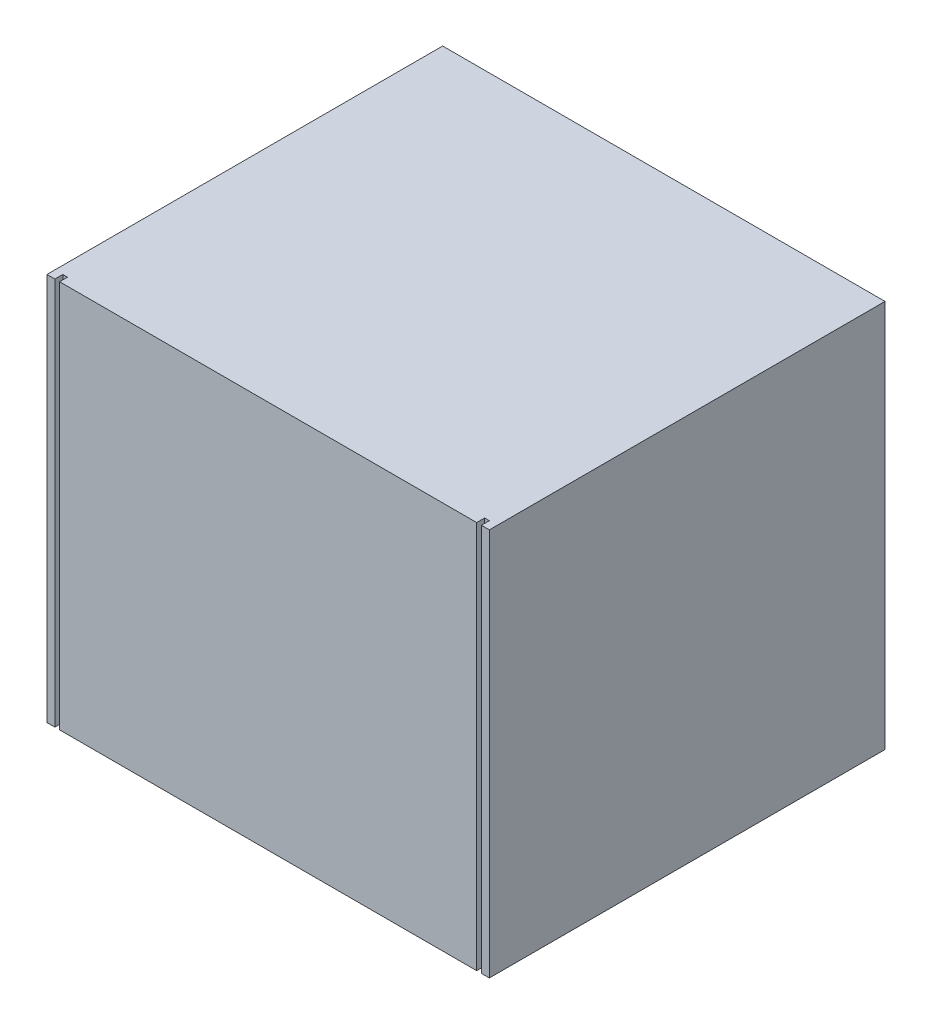
ISO-10303-21;
HEADER;
FILE_DESCRIPTION(('STEP AP214'),'2;1');
FILE_NAME('part.step','',(''),(''),'','','');
FILE_SCHEMA(('AUTOMOTIVE_DESIGN { 1 0 10303 214 1 1 1 1 }'));
ENDSEC;
DATA;
#1=APPLICATION_CONTEXT('core data for automotive mechanical design processes');
#2=APPLICATION_PROTOCOL_DEFINITION('international standard','automotive_design',2000,#1);
#3=PRODUCT_CONTEXT('',#1,'mechanical');
#4=PRODUCT('Part','Part','',(#3));
#5=PRODUCT_RELATED_PRODUCT_CATEGORY('part','',(#4));
#6=PRODUCT_DEFINITION_FORMATION('','',#4);
#7=PRODUCT_DEFINITION_CONTEXT('part definition',#1,'design');
#8=PRODUCT_DEFINITION('design','',#6,#7);
#9=PRODUCT_DEFINITION_SHAPE('','',#8);
#10=(LENGTH_UNIT() NAMED_UNIT(*) SI_UNIT(.MILLI.,.METRE.));
#11=(NAMED_UNIT(*) PLANE_ANGLE_UNIT() SI_UNIT($,.RADIAN.));
#12=(NAMED_UNIT(*) SI_UNIT($,.STERADIAN.) SOLID_ANGLE_UNIT());
#13=UNCERTAINTY_MEASURE_WITH_UNIT(LENGTH_MEASURE(1.E-05),#10,'distance_accuracy_value','');
#14=(GEOMETRIC_REPRESENTATION_CONTEXT(3) GLOBAL_UNCERTAINTY_ASSIGNED_CONTEXT((#13)) GLOBAL_UNIT_ASSIGNED_CONTEXT((#10,
#11,#12)) REPRESENTATION_CONTEXT('',''));
#15=CARTESIAN_POINT('',(0.,0.,0.));
#16=DIRECTION('',(0.,0.,1.));
#17=DIRECTION('',(1.,0.,0.));
#18=AXIS2_PLACEMENT_3D('',#15,#16,#17);
#19=CARTESIAN_POINT('',(0.,0.,400.));
#20=DIRECTION('',(0.,0.,1.));
#21=DIRECTION('',(1.,0.,0.));
#22=AXIS2_PLACEMENT_3D('',#19,#20,#21);
#23=PLANE('',#22);
#24=DIRECTION('',(1.,0.,0.));
#25=VECTOR('',#24,1.);
#26=CARTESIAN_POINT('',(561.74329509592,-634.980484230859,400.));
#27=LINE('',#26,#25);
#28=CARTESIAN_POINT('',(2.72798718913064,-634.980484230859,400.));
#29=VERTEX_POINT('',#28);
#30=CARTESIAN_POINT('',(12.7279871891305,-634.980484230859,400.));
#31=VERTEX_POINT('',#30);
#32=EDGE_CURVE('E461',#29,#31,#27,.T.);
#33=ORIENTED_EDGE('',*,*,#32,.T.);
#34=DIRECTION('',(0.,1.,0.));
#35=VECTOR('',#34,1.);
#36=CARTESIAN_POINT('',(12.7279871891305,-634.980484230859,400.));
#37=LINE('',#36,#35);
#38=CARTESIAN_POINT('',(12.7279871891306,-144.547592356546,400.));
#39=VERTEX_POINT('',#38);
#40=EDGE_CURVE('E254',#31,#39,#37,.T.);
#41=ORIENTED_EDGE('',*,*,#40,.T.);
#42=DIRECTION('',(-1.,0.,0.));
#43=VECTOR('',#42,1.);
#44=CARTESIAN_POINT('',(2.72798718913064,-144.547592356546,400.));
#45=LINE('',#44,#43);
#46=CARTESIAN_POINT('',(2.72798718913064,-144.547592356546,400.));
#47=VERTEX_POINT('',#46);
#48=EDGE_CURVE('E463',#39,#47,#45,.T.);
#49=ORIENTED_EDGE('',*,*,#48,.T.);
#50=DIRECTION('',(0.,-1.,0.));
#51=VECTOR('',#50,1.);
#52=CARTESIAN_POINT('',(2.72798718913061,44.9374361290352,400.));
#53=LINE('',#52,#51);
#54=EDGE_CURVE('E46',#47,#29,#53,.T.);
#55=ORIENTED_EDGE('',*,*,#54,.T.);
#56=EDGE_LOOP('',(#33,#41,#49,#55));
#57=FACE_BOUND('',#56,.T.);
#58=ADVANCED_FACE('F38',(#57),#23,.T.);
#59=CARTESIAN_POINT('',(545.74329509592,-144.547592356546,400.));
#60=VERTEX_POINT('',#59);
#61=CARTESIAN_POINT('',(18.7279871891306,-144.547592356546,400.));
#62=VERTEX_POINT('',#61);
#63=EDGE_CURVE('E469',#60,#62,#45,.T.);
#64=ORIENTED_EDGE('',*,*,#63,.T.);
#65=DIRECTION('',(0.,-1.,0.));
#66=VECTOR('',#65,1.);
#67=CARTESIAN_POINT('',(18.7279871891306,-144.547592356546,400.));
#68=LINE('',#67,#66);
#69=CARTESIAN_POINT('',(18.7279871891305,-634.980484230859,400.));
#70=VERTEX_POINT('',#69);
#71=EDGE_CURVE('E265',#62,#70,#68,.T.);
#72=ORIENTED_EDGE('',*,*,#71,.T.);
#73=CARTESIAN_POINT('',(545.74329509592,-634.980484230859,400.));
#74=VERTEX_POINT('',#73);
#75=EDGE_CURVE('E464',#70,#74,#27,.T.);
#76=ORIENTED_EDGE('',*,*,#75,.T.);
#77=DIRECTION('',(0.,-1.,0.));
#78=VECTOR('',#77,1.);
#79=CARTESIAN_POINT('',(545.74329509592,-144.547592356546,400.));
#80=LINE('',#79,#78);
#81=EDGE_CURVE('E285',#60,#74,#80,.T.);
#82=ORIENTED_EDGE('',*,*,#81,.F.);
#83=EDGE_LOOP('',(#64,#72,#76,#82));
#84=FACE_BOUND('',#83,.T.);
#85=ADVANCED_FACE('F502',(#84),#23,.T.);
#86=CARTESIAN_POINT('',(561.74329509592,-634.980484230859,-2.22044604925031E-13));
#87=DIRECTION('',(0.,-1.,0.));
#88=DIRECTION('',(0.,0.,-1.));
#89=AXIS2_PLACEMENT_3D('',#86,#87,#88);
#90=PLANE('',#89);
#91=DIRECTION('',(-1.,0.,0.));
#92=VECTOR('',#91,1.);
#93=CARTESIAN_POINT('',(18.7279871891305,-634.980484230859,390.));
#94=LINE('',#93,#92);
#95=CARTESIAN_POINT('',(18.7279871891305,-634.980484230859,390.));
#96=VERTEX_POINT('',#95);
#97=CARTESIAN_POINT('',(12.7279871891305,-634.980484230859,390.));
#98=VERTEX_POINT('',#97);
#99=EDGE_CURVE('E262',#96,#98,#94,.T.);
#100=ORIENTED_EDGE('',*,*,#99,.T.);
#101=DIRECTION('',(0.,0.,1.));
#102=VECTOR('',#101,1.);
#103=CARTESIAN_POINT('',(12.7279871891305,-634.980484230859,390.));
#104=LINE('',#103,#102);
#105=EDGE_CURVE('E248',#98,#31,#104,.T.);
#106=ORIENTED_EDGE('',*,*,#105,.T.);
#107=ORIENTED_EDGE('',*,*,#32,.F.);
#108=DIRECTION('',(0.,0.,1.));
#109=VECTOR('',#108,1.);
#110=CARTESIAN_POINT('',(2.72798718913064,-634.980484230859,-2.22044604925031E-13));
#111=LINE('',#110,#109);
#112=CARTESIAN_POINT('',(2.72798718913073,-634.980484230859,-100.));
#113=VERTEX_POINT('',#112);
#114=EDGE_CURVE('E468',#113,#29,#111,.T.);
#115=ORIENTED_EDGE('',*,*,#114,.F.);
#116=DIRECTION('',(-1.,0.,0.));
#117=VECTOR('',#116,1.);
#118=CARTESIAN_POINT('',(561.74329509592,-634.980484230859,-100.));
#119=LINE('',#118,#117);
#120=CARTESIAN_POINT('',(561.74329509592,-634.980484230859,-100.));
#121=VERTEX_POINT('',#120);
#122=EDGE_CURVE('E457',#121,#113,#119,.T.);
#123=ORIENTED_EDGE('',*,*,#122,.F.);
#124=DIRECTION('',(0.,0.,1.));
#125=VECTOR('',#124,1.);
#126=CARTESIAN_POINT('',(561.74329509592,-634.980484230859,-2.22044604925031E-13));
#127=LINE('',#126,#125);
#128=CARTESIAN_POINT('',(561.74329509592,-634.980484230859,400.));
#129=VERTEX_POINT('',#128);
#130=EDGE_CURVE('E476',#121,#129,#127,.T.);
#131=ORIENTED_EDGE('',*,*,#130,.T.);
#132=CARTESIAN_POINT('',(551.74329509592,-634.980484230859,400.));
#133=VERTEX_POINT('',#132);
#134=EDGE_CURVE('E460',#133,#129,#27,.T.);
#135=ORIENTED_EDGE('',*,*,#134,.F.);
#136=DIRECTION('',(0.,0.,1.));
#137=VECTOR('',#136,1.);
#138=CARTESIAN_POINT('',(551.74329509592,-634.980484230859,390.));
#139=LINE('',#138,#137);
#140=CARTESIAN_POINT('',(551.74329509592,-634.980484230859,390.));
#141=VERTEX_POINT('',#140);
#142=EDGE_CURVE('E296',#141,#133,#139,.T.);
#143=ORIENTED_EDGE('',*,*,#142,.F.);
#144=DIRECTION('',(1.,0.,0.));
#145=VECTOR('',#144,1.);
#146=CARTESIAN_POINT('',(545.74329509592,-634.980484230859,390.));
#147=LINE('',#146,#145);
#148=CARTESIAN_POINT('',(545.74329509592,-634.980484230859,390.));
#149=VERTEX_POINT('',#148);
#150=EDGE_CURVE('E290',#149,#141,#147,.T.);
#151=ORIENTED_EDGE('',*,*,#150,.F.);
#152=DIRECTION('',(0.,0.,1.));
#153=VECTOR('',#152,1.);
#154=CARTESIAN_POINT('',(545.74329509592,-634.980484230859,390.));
#155=LINE('',#154,#153);
#156=EDGE_CURVE('E299',#149,#74,#155,.T.);
#157=ORIENTED_EDGE('',*,*,#156,.T.);
#158=ORIENTED_EDGE('',*,*,#75,.F.);
#159=DIRECTION('',(0.,0.,1.));
#160=VECTOR('',#159,1.);
#161=CARTESIAN_POINT('',(18.7279871891305,-634.980484230859,390.));
#162=LINE('',#161,#160);
#163=EDGE_CURVE('E258',#96,#70,#162,.T.);
#164=ORIENTED_EDGE('',*,*,#163,.F.);
#165=EDGE_LOOP('',(#100,#106,#107,#115,#123,#131,#135,#143,#151,#157,#158,#164));
#166=FACE_BOUND('',#165,.T.);
#167=ADVANCED_FACE('F267',(#166),#90,.T.);
#168=CARTESIAN_POINT('',(2.72798718913064,-144.547592356546,-2.22044604925031E-13));
#169=DIRECTION('',(0.,1.,0.));
#170=DIRECTION('',(0.,0.,1.));
#171=AXIS2_PLACEMENT_3D('',#168,#169,#170);
#172=PLANE('',#171);
#173=ORIENTED_EDGE('',*,*,#48,.F.);
#174=DIRECTION('',(0.,0.,1.));
#175=VECTOR('',#174,1.);
#176=CARTESIAN_POINT('',(12.7279871891306,-144.547592356546,390.));
#177=LINE('',#176,#175);
#178=CARTESIAN_POINT('',(12.7279871891306,-144.547592356546,390.));
#179=VERTEX_POINT('',#178);
#180=EDGE_CURVE('E276',#179,#39,#177,.T.);
#181=ORIENTED_EDGE('',*,*,#180,.F.);
#182=DIRECTION('',(1.,0.,0.));
#183=VECTOR('',#182,1.);
#184=CARTESIAN_POINT('',(12.7279871891306,-144.547592356546,390.));
#185=LINE('',#184,#183);
#186=CARTESIAN_POINT('',(18.7279871891306,-144.547592356546,390.));
#187=VERTEX_POINT('',#186);
#188=EDGE_CURVE('E259',#179,#187,#185,.T.);
#189=ORIENTED_EDGE('',*,*,#188,.T.);
#190=DIRECTION('',(0.,0.,1.));
#191=VECTOR('',#190,1.);
#192=CARTESIAN_POINT('',(18.7279871891306,-144.547592356546,390.));
#193=LINE('',#192,#191);
#194=EDGE_CURVE('E279',#187,#62,#193,.T.);
#195=ORIENTED_EDGE('',*,*,#194,.T.);
#196=ORIENTED_EDGE('',*,*,#63,.F.);
#197=DIRECTION('',(0.,0.,1.));
#198=VECTOR('',#197,1.);
#199=CARTESIAN_POINT('',(545.74329509592,-144.547592356546,390.));
#200=LINE('',#199,#198);
#201=CARTESIAN_POINT('',(545.74329509592,-144.547592356546,390.));
#202=VERTEX_POINT('',#201);
#203=EDGE_CURVE('E302',#202,#60,#200,.T.);
#204=ORIENTED_EDGE('',*,*,#203,.F.);
#205=DIRECTION('',(-1.,0.,0.));
#206=VECTOR('',#205,1.);
#207=CARTESIAN_POINT('',(551.74329509592,-144.547592356546,390.));
#208=LINE('',#207,#206);
#209=CARTESIAN_POINT('',(551.74329509592,-144.547592356546,390.));
#210=VERTEX_POINT('',#209);
#211=EDGE_CURVE('E284',#210,#202,#208,.T.);
#212=ORIENTED_EDGE('',*,*,#211,.F.);
#213=DIRECTION('',(0.,0.,1.));
#214=VECTOR('',#213,1.);
#215=CARTESIAN_POINT('',(551.74329509592,-144.547592356546,390.));
#216=LINE('',#215,#214);
#217=CARTESIAN_POINT('',(551.74329509592,-144.547592356546,400.));
#218=VERTEX_POINT('',#217);
#219=EDGE_CURVE('E292',#210,#218,#216,.T.);
#220=ORIENTED_EDGE('',*,*,#219,.T.);
#221=CARTESIAN_POINT('',(561.74329509592,-144.547592356546,400.));
#222=VERTEX_POINT('',#221);
#223=EDGE_CURVE('E465',#222,#218,#45,.T.);
#224=ORIENTED_EDGE('',*,*,#223,.F.);
#225=DIRECTION('',(0.,0.,1.));
#226=VECTOR('',#225,1.);
#227=CARTESIAN_POINT('',(561.74329509592,-144.547592356546,-2.22044604925031E-13));
#228=LINE('',#227,#226);
#229=CARTESIAN_POINT('',(561.74329509592,-144.547592356546,-100.));
#230=VERTEX_POINT('',#229);
#231=EDGE_CURVE('E473',#230,#222,#228,.T.);
#232=ORIENTED_EDGE('',*,*,#231,.F.);
#233=DIRECTION('',(1.,0.,0.));
#234=VECTOR('',#233,1.);
#235=CARTESIAN_POINT('',(2.72798718913064,-144.547592356546,-100.));
#236=LINE('',#235,#234);
#237=CARTESIAN_POINT('',(2.72798718913064,-144.547592356546,-100.));
#238=VERTEX_POINT('',#237);
#239=EDGE_CURVE('E451',#238,#230,#236,.T.);
#240=ORIENTED_EDGE('',*,*,#239,.F.);
#241=DIRECTION('',(0.,0.,1.));
#242=VECTOR('',#241,1.);
#243=CARTESIAN_POINT('',(2.72798718913064,-144.547592356546,-2.22044604925031E-13));
#244=LINE('',#243,#242);
#245=EDGE_CURVE('E470',#238,#47,#244,.T.);
#246=ORIENTED_EDGE('',*,*,#245,.T.);
#247=EDGE_LOOP('',(#173,#181,#189,#195,#196,#204,#212,#220,#224,#232,#240,#246));
#248=FACE_BOUND('',#247,.T.);
#249=ADVANCED_FACE('F510',(#248),#172,.T.);
#250=DIRECTION('',(0.,1.,0.));
#251=VECTOR('',#250,1.);
#252=CARTESIAN_POINT('',(551.74329509592,-634.980484230859,400.));
#253=LINE('',#252,#251);
#254=EDGE_CURVE('E278',#133,#218,#253,.T.);
#255=ORIENTED_EDGE('',*,*,#254,.F.);
#256=ORIENTED_EDGE('',*,*,#134,.T.);
#257=DIRECTION('',(0.,1.,0.));
#258=VECTOR('',#257,1.);
#259=CARTESIAN_POINT('',(561.74329509592,-635.062563870961,400.));
#260=LINE('',#259,#258);
#261=EDGE_CURVE('E12',#129,#222,#260,.T.);
#262=ORIENTED_EDGE('',*,*,#261,.T.);
#263=ORIENTED_EDGE('',*,*,#223,.T.);
#264=EDGE_LOOP('',(#255,#256,#262,#263));
#265=FACE_BOUND('',#264,.T.);
#266=ADVANCED_FACE('F523',(#265),#23,.T.);
#267=CARTESIAN_POINT('',(561.74329509592,-604.980484230859,-2.22044604925031E-13));
#268=DIRECTION('',(0.,-1.,0.));
#269=DIRECTION('',(0.,0.,-1.));
#270=AXIS2_PLACEMENT_3D('',#267,#268,#269);
#271=PLANE('',#270);
#272=DIRECTION('',(1.,0.,0.));
#273=VECTOR('',#272,1.);
#274=CARTESIAN_POINT('',(32.7279871891307,-604.980484230859,-79.));
#275=LINE('',#274,#273);
#276=CARTESIAN_POINT('',(32.7279871891307,-604.980484230859,-79.));
#277=VERTEX_POINT('',#276);
#278=CARTESIAN_POINT('',(531.74329509592,-604.980484230859,-79.));
#279=VERTEX_POINT('',#278);
#280=EDGE_CURVE('E298',#277,#279,#275,.T.);
#281=ORIENTED_EDGE('',*,*,#280,.T.);
#282=DIRECTION('',(0.,0.,1.));
#283=VECTOR('',#282,1.);
#284=CARTESIAN_POINT('',(531.74329509592,-604.980484230859,400.));
#285=LINE('',#284,#283);
#286=CARTESIAN_POINT('',(531.74329509592,-604.980484230859,-84.));
#287=VERTEX_POINT('',#286);
#288=EDGE_CURVE('E439',#287,#279,#285,.T.);
#289=ORIENTED_EDGE('',*,*,#288,.F.);
#290=DIRECTION('',(-1.,0.,0.));
#291=VECTOR('',#290,1.);
#292=CARTESIAN_POINT('',(531.74329509592,-604.980484230859,-84.));
#293=LINE('',#292,#291);
#294=CARTESIAN_POINT('',(32.7279871891307,-604.980484230859,-84.0000000000001));
#295=VERTEX_POINT('',#294);
#296=EDGE_CURVE('E334',#287,#295,#293,.T.);
#297=ORIENTED_EDGE('',*,*,#296,.T.);
#298=DIRECTION('',(0.,0.,1.));
#299=VECTOR('',#298,1.);
#300=CARTESIAN_POINT('',(32.7279871891307,-604.980484230859,-2.22044604925031E-13));
#301=LINE('',#300,#299);
#302=EDGE_CURVE('E416',#295,#277,#301,.T.);
#303=ORIENTED_EDGE('',*,*,#302,.T.);
#304=EDGE_LOOP('',(#281,#289,#297,#303));
#305=FACE_BOUND('',#304,.T.);
#306=ADVANCED_FACE('F529',(#305),#271,.F.);
#307=DIRECTION('',(-1.,0.,0.));
#308=VECTOR('',#307,1.);
#309=CARTESIAN_POINT('',(531.74329509592,-604.980484230859,-73.));
#310=LINE('',#309,#308);
#311=CARTESIAN_POINT('',(531.74329509592,-604.980484230859,-73.));
#312=VERTEX_POINT('',#311);
#313=CARTESIAN_POINT('',(32.7279871891307,-604.980484230859,-73.));
#314=VERTEX_POINT('',#313);
#315=EDGE_CURVE('E310',#312,#314,#310,.T.);
#316=ORIENTED_EDGE('',*,*,#315,.T.);
#317=CARTESIAN_POINT('',(32.7279871891307,-604.980484230859,370.));
#318=VERTEX_POINT('',#317);
#319=EDGE_CURVE('E417',#314,#318,#301,.T.);
#320=ORIENTED_EDGE('',*,*,#319,.T.);
#321=DIRECTION('',(1.,0.,0.));
#322=VECTOR('',#321,1.);
#323=CARTESIAN_POINT('',(0.,-604.980484230859,370.));
#324=LINE('',#323,#322);
#325=CARTESIAN_POINT('',(531.74329509592,-604.980484230859,370.));
#326=VERTEX_POINT('',#325);
#327=EDGE_CURVE('E427',#318,#326,#324,.T.);
#328=ORIENTED_EDGE('',*,*,#327,.T.);
#329=EDGE_CURVE('E415',#312,#326,#285,.T.);
#330=ORIENTED_EDGE('',*,*,#329,.F.);
#331=EDGE_LOOP('',(#316,#320,#328,#330));
#332=FACE_BOUND('',#331,.T.);
#333=ADVANCED_FACE('F534',(#332),#271,.F.);
#334=DIRECTION('',(1.,0.,0.));
#335=VECTOR('',#334,1.);
#336=CARTESIAN_POINT('',(531.74329509592,-604.980484230859,-90.));
#337=LINE('',#336,#335);
#338=CARTESIAN_POINT('',(32.7279871891307,-604.980484230859,-90.0000000000001));
#339=VERTEX_POINT('',#338);
#340=CARTESIAN_POINT('',(531.74329509592,-604.980484230859,-90.));
#341=VERTEX_POINT('',#340);
#342=EDGE_CURVE('E323',#339,#341,#337,.T.);
#343=ORIENTED_EDGE('',*,*,#342,.T.);
#344=CARTESIAN_POINT('',(531.74329509592,-604.980484230859,-100.));
#345=VERTEX_POINT('',#344);
#346=EDGE_CURVE('E436',#345,#341,#285,.T.);
#347=ORIENTED_EDGE('',*,*,#346,.F.);
#348=DIRECTION('',(-1.,0.,0.));
#349=VECTOR('',#348,1.);
#350=CARTESIAN_POINT('',(0.,-604.980484230859,-100.));
#351=LINE('',#350,#349);
#352=CARTESIAN_POINT('',(32.7279871891307,-604.980484230859,-100.));
#353=VERTEX_POINT('',#352);
#354=EDGE_CURVE('E430',#345,#353,#351,.T.);
#355=ORIENTED_EDGE('',*,*,#354,.T.);
#356=EDGE_CURVE('E412',#353,#339,#301,.T.);
#357=ORIENTED_EDGE('',*,*,#356,.T.);
#358=EDGE_LOOP('',(#343,#347,#355,#357));
#359=FACE_BOUND('',#358,.T.);
#360=ADVANCED_FACE('F537',(#359),#271,.F.);
#361=CARTESIAN_POINT('',(2.72798718913064,-174.547592356546,-2.22044604925031E-13));
#362=DIRECTION('',(0.,1.,0.));
#363=DIRECTION('',(0.,0.,1.));
#364=AXIS2_PLACEMENT_3D('',#361,#362,#363);
#365=PLANE('',#364);
#366=DIRECTION('',(0.,0.,1.));
#367=VECTOR('',#366,1.);
#368=CARTESIAN_POINT('',(531.74329509592,-174.547592356546,-2.22044604925031E-13));
#369=LINE('',#368,#367);
#370=CARTESIAN_POINT('',(531.74329509592,-174.547592356546,-84.));
#371=VERTEX_POINT('',#370);
#372=CARTESIAN_POINT('',(531.74329509592,-174.547592356546,-79.));
#373=VERTEX_POINT('',#372);
#374=EDGE_CURVE('E434',#371,#373,#369,.T.);
#375=ORIENTED_EDGE('',*,*,#374,.T.);
#376=DIRECTION('',(1.,0.,0.));
#377=VECTOR('',#376,1.);
#378=CARTESIAN_POINT('',(32.7279871891307,-174.547592356546,-79.));
#379=LINE('',#378,#377);
#380=CARTESIAN_POINT('',(32.7279871891307,-174.547592356546,-79.));
#381=VERTEX_POINT('',#380);
#382=EDGE_CURVE('E347',#381,#373,#379,.T.);
#383=ORIENTED_EDGE('',*,*,#382,.F.);
#384=DIRECTION('',(0.,0.,1.));
#385=VECTOR('',#384,1.);
#386=CARTESIAN_POINT('',(32.7279871891307,-174.547592356546,400.));
#387=LINE('',#386,#385);
#388=CARTESIAN_POINT('',(32.7279871891307,-174.547592356546,-84.0000000000001));
#389=VERTEX_POINT('',#388);
#390=EDGE_CURVE('E410',#389,#381,#387,.T.);
#391=ORIENTED_EDGE('',*,*,#390,.F.);
#392=DIRECTION('',(-1.,0.,0.));
#393=VECTOR('',#392,1.);
#394=CARTESIAN_POINT('',(531.74329509592,-174.547592356546,-84.));
#395=LINE('',#394,#393);
#396=EDGE_CURVE('E384',#371,#389,#395,.T.);
#397=ORIENTED_EDGE('',*,*,#396,.F.);
#398=EDGE_LOOP('',(#375,#383,#391,#397));
#399=FACE_BOUND('',#398,.T.);
#400=ADVANCED_FACE('F611',(#399),#365,.F.);
#401=CARTESIAN_POINT('',(531.74329509592,-174.547592356546,-100.));
#402=VERTEX_POINT('',#401);
#403=CARTESIAN_POINT('',(531.74329509592,-174.547592356546,-90.));
#404=VERTEX_POINT('',#403);
#405=EDGE_CURVE('E431',#402,#404,#369,.T.);
#406=ORIENTED_EDGE('',*,*,#405,.T.);
#407=DIRECTION('',(1.,0.,0.));
#408=VECTOR('',#407,1.);
#409=CARTESIAN_POINT('',(531.74329509592,-174.547592356546,-90.));
#410=LINE('',#409,#408);
#411=CARTESIAN_POINT('',(32.7279871891307,-174.547592356546,-90.0000000000001));
#412=VERTEX_POINT('',#411);
#413=EDGE_CURVE('E373',#412,#404,#410,.T.);
#414=ORIENTED_EDGE('',*,*,#413,.F.);
#415=CARTESIAN_POINT('',(32.7279871891307,-174.547592356546,-100.));
#416=VERTEX_POINT('',#415);
#417=EDGE_CURVE('E406',#416,#412,#387,.T.);
#418=ORIENTED_EDGE('',*,*,#417,.F.);
#419=DIRECTION('',(1.,0.,0.));
#420=VECTOR('',#419,1.);
#421=CARTESIAN_POINT('',(0.,-174.547592356546,-100.));
#422=LINE('',#421,#420);
#423=EDGE_CURVE('E442',#416,#402,#422,.T.);
#424=ORIENTED_EDGE('',*,*,#423,.T.);
#425=EDGE_LOOP('',(#406,#414,#418,#424));
#426=FACE_BOUND('',#425,.T.);
#427=ADVANCED_FACE('F616',(#426),#365,.F.);
#428=CARTESIAN_POINT('',(2.72798718913061,44.9374361290352,400.));
#429=DIRECTION('',(1.,0.,0.));
#430=DIRECTION('',(0.,1.,0.));
#431=AXIS2_PLACEMENT_3D('',#428,#429,#430);
#432=PLANE('',#431);
#433=ORIENTED_EDGE('',*,*,#245,.F.);
#434=DIRECTION('',(0.,1.,0.));
#435=VECTOR('',#434,1.);
#436=CARTESIAN_POINT('',(2.72798718913073,-634.980484230859,-100.));
#437=LINE('',#436,#435);
#438=EDGE_CURVE('E423',#113,#238,#437,.T.);
#439=ORIENTED_EDGE('',*,*,#438,.F.);
#440=ORIENTED_EDGE('',*,*,#114,.T.);
#441=ORIENTED_EDGE('',*,*,#54,.F.);
#442=EDGE_LOOP('',(#433,#439,#440,#441));
#443=FACE_BOUND('',#442,.T.);
#444=ADVANCED_FACE('F40',(#443),#432,.F.);
#445=CARTESIAN_POINT('',(561.74329509592,-635.062563870961,400.));
#446=DIRECTION('',(-1.,0.,0.));
#447=DIRECTION('',(0.,0.,1.));
#448=AXIS2_PLACEMENT_3D('',#445,#446,#447);
#449=PLANE('',#448);
#450=ORIENTED_EDGE('',*,*,#231,.T.);
#451=ORIENTED_EDGE('',*,*,#261,.F.);
#452=ORIENTED_EDGE('',*,*,#130,.F.);
#453=DIRECTION('',(0.,-1.,0.));
#454=VECTOR('',#453,1.);
#455=CARTESIAN_POINT('',(561.74329509592,-144.547592356546,-100.));
#456=LINE('',#455,#454);
#457=EDGE_CURVE('E454',#230,#121,#456,.T.);
#458=ORIENTED_EDGE('',*,*,#457,.F.);
#459=EDGE_LOOP('',(#450,#451,#452,#458));
#460=FACE_BOUND('',#459,.T.);
#461=ADVANCED_FACE('F492',(#460),#449,.F.);
#462=CARTESIAN_POINT('',(0.,0.,-100.));
#463=DIRECTION('',(0.,0.,-1.));
#464=DIRECTION('',(-1.,0.,0.));
#465=AXIS2_PLACEMENT_3D('',#462,#463,#464);
#466=PLANE('',#465);
#467=DIRECTION('',(0.,1.,0.));
#468=VECTOR('',#467,1.);
#469=CARTESIAN_POINT('',(32.7279871891306,44.9374361290352,-100.));
#470=LINE('',#469,#468);
#471=EDGE_CURVE('E399',#353,#416,#470,.T.);
#472=ORIENTED_EDGE('',*,*,#471,.F.);
#473=ORIENTED_EDGE('',*,*,#354,.F.);
#474=DIRECTION('',(0.,-1.,0.));
#475=VECTOR('',#474,1.);
#476=CARTESIAN_POINT('',(531.74329509592,-635.062563870961,-100.));
#477=LINE('',#476,#475);
#478=EDGE_CURVE('E445',#402,#345,#477,.T.);
#479=ORIENTED_EDGE('',*,*,#478,.F.);
#480=ORIENTED_EDGE('',*,*,#423,.F.);
#481=EDGE_LOOP('',(#472,#473,#479,#480));
#482=FACE_BOUND('',#481,.T.);
#483=ORIENTED_EDGE('',*,*,#438,.T.);
#484=ORIENTED_EDGE('',*,*,#239,.T.);
#485=ORIENTED_EDGE('',*,*,#457,.T.);
#486=ORIENTED_EDGE('',*,*,#122,.T.);
#487=EDGE_LOOP('',(#483,#484,#485,#486));
#488=FACE_BOUND('',#487,.T.);
#489=ADVANCED_FACE('F489',(#482,#488),#466,.T.);
#490=CARTESIAN_POINT('',(32.7279871891306,44.9374361290352,400.));
#491=DIRECTION('',(1.,0.,0.));
#492=DIRECTION('',(0.,1.,0.));
#493=AXIS2_PLACEMENT_3D('',#490,#491,#492);
#494=PLANE('',#493);
#495=ORIENTED_EDGE('',*,*,#417,.T.);
#496=DIRECTION('',(0.,-1.,0.));
#497=VECTOR('',#496,1.);
#498=CARTESIAN_POINT('',(32.7279871891307,-164.547592356546,-90.0000000000001));
#499=LINE('',#498,#497);
#500=CARTESIAN_POINT('',(32.7279871891307,-164.547592356546,-90.0000000000001));
#501=VERTEX_POINT('',#500);
#502=EDGE_CURVE('E397',#501,#412,#499,.T.);
#503=ORIENTED_EDGE('',*,*,#502,.F.);
#504=DIRECTION('',(0.,0.,-1.));
#505=VECTOR('',#504,1.);
#506=CARTESIAN_POINT('',(32.7279871891307,-164.547592356546,-84.0000000000001));
#507=LINE('',#506,#505);
#508=CARTESIAN_POINT('',(32.7279871891307,-164.547592356546,-84.0000000000001));
#509=VERTEX_POINT('',#508);
#510=EDGE_CURVE('E390',#509,#501,#507,.T.);
#511=ORIENTED_EDGE('',*,*,#510,.F.);
#512=DIRECTION('',(0.,-1.,0.));
#513=VECTOR('',#512,1.);
#514=CARTESIAN_POINT('',(32.7279871891307,-164.547592356546,-84.0000000000001));
#515=LINE('',#514,#513);
#516=EDGE_CURVE('E400',#509,#389,#515,.T.);
#517=ORIENTED_EDGE('',*,*,#516,.T.);
#518=ORIENTED_EDGE('',*,*,#390,.T.);
#519=DIRECTION('',(0.,-1.,0.));
#520=VECTOR('',#519,1.);
#521=CARTESIAN_POINT('',(32.7279871891307,-164.547592356546,-79.));
#522=LINE('',#521,#520);
#523=CARTESIAN_POINT('',(32.7279871891307,-164.547592356546,-79.));
#524=VERTEX_POINT('',#523);
#525=EDGE_CURVE('E371',#524,#381,#522,.T.);
#526=ORIENTED_EDGE('',*,*,#525,.F.);
#527=DIRECTION('',(0.,0.,-1.));
#528=VECTOR('',#527,1.);
#529=CARTESIAN_POINT('',(32.7279871891307,-164.547592356546,-73.));
#530=LINE('',#529,#528);
#531=CARTESIAN_POINT('',(32.7279871891307,-164.547592356546,-73.));
#532=VERTEX_POINT('',#531);
#533=EDGE_CURVE('E364',#532,#524,#530,.T.);
#534=ORIENTED_EDGE('',*,*,#533,.F.);
#535=DIRECTION('',(0.,-1.,0.));
#536=VECTOR('',#535,1.);
#537=CARTESIAN_POINT('',(32.7279871891307,-164.547592356546,-73.));
#538=LINE('',#537,#536);
#539=CARTESIAN_POINT('',(32.7279871891307,-174.547592356546,-73.));
#540=VERTEX_POINT('',#539);
#541=EDGE_CURVE('E374',#532,#540,#538,.T.);
#542=ORIENTED_EDGE('',*,*,#541,.T.);
#543=CARTESIAN_POINT('',(32.7279871891307,-174.547592356546,370.));
#544=VERTEX_POINT('',#543);
#545=EDGE_CURVE('E411',#540,#544,#387,.T.);
#546=ORIENTED_EDGE('',*,*,#545,.T.);
#547=DIRECTION('',(0.,-1.,0.));
#548=VECTOR('',#547,1.);
#549=CARTESIAN_POINT('',(32.7279871891306,44.9374361290352,370.));
#550=LINE('',#549,#548);
#551=EDGE_CURVE('E409',#544,#318,#550,.T.);
#552=ORIENTED_EDGE('',*,*,#551,.T.);
#553=ORIENTED_EDGE('',*,*,#319,.F.);
#554=DIRECTION('',(0.,1.,0.));
#555=VECTOR('',#554,1.);
#556=CARTESIAN_POINT('',(32.7279871891307,-614.980484230859,-73.));
#557=LINE('',#556,#555);
#558=CARTESIAN_POINT('',(32.7279871891307,-614.980484230859,-73.));
#559=VERTEX_POINT('',#558);
#560=EDGE_CURVE('E327',#559,#314,#557,.T.);
#561=ORIENTED_EDGE('',*,*,#560,.F.);
#562=DIRECTION('',(0.,0.,-1.));
#563=VECTOR('',#562,1.);
#564=CARTESIAN_POINT('',(32.7279871891307,-614.980484230859,-73.));
#565=LINE('',#564,#563);
#566=CARTESIAN_POINT('',(32.7279871891307,-614.980484230859,-79.));
#567=VERTEX_POINT('',#566);
#568=EDGE_CURVE('E309',#559,#567,#565,.T.);
#569=ORIENTED_EDGE('',*,*,#568,.T.);
#570=DIRECTION('',(0.,1.,0.));
#571=VECTOR('',#570,1.);
#572=CARTESIAN_POINT('',(32.7279871891307,-614.980484230859,-79.));
#573=LINE('',#572,#571);
#574=EDGE_CURVE('E316',#567,#277,#573,.T.);
#575=ORIENTED_EDGE('',*,*,#574,.T.);
#576=ORIENTED_EDGE('',*,*,#302,.F.);
#577=DIRECTION('',(0.,1.,0.));
#578=VECTOR('',#577,1.);
#579=CARTESIAN_POINT('',(32.7279871891307,-614.980484230859,-84.0000000000001));
#580=LINE('',#579,#578);
#581=CARTESIAN_POINT('',(32.7279871891307,-614.980484230859,-84.0000000000001));
#582=VERTEX_POINT('',#581);
#583=EDGE_CURVE('E350',#582,#295,#580,.T.);
#584=ORIENTED_EDGE('',*,*,#583,.F.);
#585=DIRECTION('',(0.,0.,-1.));
#586=VECTOR('',#585,1.);
#587=CARTESIAN_POINT('',(32.7279871891307,-614.980484230859,-84.0000000000001));
#588=LINE('',#587,#586);
#589=CARTESIAN_POINT('',(32.7279871891307,-614.980484230859,-90.0000000000001));
#590=VERTEX_POINT('',#589);
#591=EDGE_CURVE('E333',#582,#590,#588,.T.);
#592=ORIENTED_EDGE('',*,*,#591,.T.);
#593=DIRECTION('',(0.,1.,0.));
#594=VECTOR('',#593,1.);
#595=CARTESIAN_POINT('',(32.7279871891307,-614.980484230859,-90.0000000000001));
#596=LINE('',#595,#594);
#597=EDGE_CURVE('E340',#590,#339,#596,.T.);
#598=ORIENTED_EDGE('',*,*,#597,.T.);
#599=ORIENTED_EDGE('',*,*,#356,.F.);
#600=ORIENTED_EDGE('',*,*,#471,.T.);
#601=EDGE_LOOP('',(#495,#503,#511,#517,#518,#526,#534,#542,#546,#552,#553,#561,#569,#575,#576,
#584,#592,#598,#599,#600));
#602=FACE_BOUND('',#601,.T.);
#603=ADVANCED_FACE('F598',(#602),#494,.T.);
#604=CARTESIAN_POINT('',(531.74329509592,-635.062563870961,400.));
#605=DIRECTION('',(-1.,0.,0.));
#606=DIRECTION('',(0.,0.,1.));
#607=AXIS2_PLACEMENT_3D('',#604,#605,#606);
#608=PLANE('',#607);
#609=ORIENTED_EDGE('',*,*,#405,.F.);
#610=ORIENTED_EDGE('',*,*,#478,.T.);
#611=ORIENTED_EDGE('',*,*,#346,.T.);
#612=DIRECTION('',(0.,1.,0.));
#613=VECTOR('',#612,1.);
#614=CARTESIAN_POINT('',(531.74329509592,-614.980484230859,-90.));
#615=LINE('',#614,#613);
#616=CARTESIAN_POINT('',(531.74329509592,-614.980484230859,-90.));
#617=VERTEX_POINT('',#616);
#618=EDGE_CURVE('E345',#617,#341,#615,.T.);
#619=ORIENTED_EDGE('',*,*,#618,.F.);
#620=DIRECTION('',(0.,0.,1.));
#621=VECTOR('',#620,1.);
#622=CARTESIAN_POINT('',(531.74329509592,-614.980484230859,-90.));
#623=LINE('',#622,#621);
#624=CARTESIAN_POINT('',(531.74329509592,-614.980484230859,-84.));
#625=VERTEX_POINT('',#624);
#626=EDGE_CURVE('E338',#617,#625,#623,.T.);
#627=ORIENTED_EDGE('',*,*,#626,.T.);
#628=DIRECTION('',(0.,1.,0.));
#629=VECTOR('',#628,1.);
#630=CARTESIAN_POINT('',(531.74329509592,-614.980484230859,-84.));
#631=LINE('',#630,#629);
#632=EDGE_CURVE('E348',#625,#287,#631,.T.);
#633=ORIENTED_EDGE('',*,*,#632,.T.);
#634=ORIENTED_EDGE('',*,*,#288,.T.);
#635=DIRECTION('',(0.,1.,0.));
#636=VECTOR('',#635,1.);
#637=CARTESIAN_POINT('',(531.74329509592,-614.980484230859,-79.));
#638=LINE('',#637,#636);
#639=CARTESIAN_POINT('',(531.74329509592,-614.980484230859,-79.));
#640=VERTEX_POINT('',#639);
#641=EDGE_CURVE('E321',#640,#279,#638,.T.);
#642=ORIENTED_EDGE('',*,*,#641,.F.);
#643=DIRECTION('',(0.,0.,1.));
#644=VECTOR('',#643,1.);
#645=CARTESIAN_POINT('',(531.74329509592,-614.980484230859,-79.));
#646=LINE('',#645,#644);
#647=CARTESIAN_POINT('',(531.74329509592,-614.980484230859,-73.));
#648=VERTEX_POINT('',#647);
#649=EDGE_CURVE('E314',#640,#648,#646,.T.);
#650=ORIENTED_EDGE('',*,*,#649,.T.);
#651=DIRECTION('',(0.,1.,0.));
#652=VECTOR('',#651,1.);
#653=CARTESIAN_POINT('',(531.74329509592,-614.980484230859,-73.));
#654=LINE('',#653,#652);
#655=EDGE_CURVE('E324',#648,#312,#654,.T.);
#656=ORIENTED_EDGE('',*,*,#655,.T.);
#657=ORIENTED_EDGE('',*,*,#329,.T.);
#658=DIRECTION('',(0.,1.,0.));
#659=VECTOR('',#658,1.);
#660=CARTESIAN_POINT('',(531.74329509592,-635.062563870961,370.));
#661=LINE('',#660,#659);
#662=CARTESIAN_POINT('',(531.74329509592,-174.547592356546,370.));
#663=VERTEX_POINT('',#662);
#664=EDGE_CURVE('E420',#326,#663,#661,.T.);
#665=ORIENTED_EDGE('',*,*,#664,.T.);
#666=CARTESIAN_POINT('',(531.74329509592,-174.547592356546,-73.));
#667=VERTEX_POINT('',#666);
#668=EDGE_CURVE('E435',#667,#663,#369,.T.);
#669=ORIENTED_EDGE('',*,*,#668,.F.);
#670=DIRECTION('',(0.,-1.,0.));
#671=VECTOR('',#670,1.);
#672=CARTESIAN_POINT('',(531.74329509592,-164.547592356546,-73.));
#673=LINE('',#672,#671);
#674=CARTESIAN_POINT('',(531.74329509592,-164.547592356546,-73.));
#675=VERTEX_POINT('',#674);
#676=EDGE_CURVE('E376',#675,#667,#673,.T.);
#677=ORIENTED_EDGE('',*,*,#676,.F.);
#678=DIRECTION('',(0.,0.,1.));
#679=VECTOR('',#678,1.);
#680=CARTESIAN_POINT('',(531.74329509592,-164.547592356546,-79.));
#681=LINE('',#680,#679);
#682=CARTESIAN_POINT('',(531.74329509592,-164.547592356546,-79.));
#683=VERTEX_POINT('',#682);
#684=EDGE_CURVE('E357',#683,#675,#681,.T.);
#685=ORIENTED_EDGE('',*,*,#684,.F.);
#686=DIRECTION('',(0.,-1.,0.));
#687=VECTOR('',#686,1.);
#688=CARTESIAN_POINT('',(531.74329509592,-164.547592356546,-79.));
#689=LINE('',#688,#687);
#690=EDGE_CURVE('E367',#683,#373,#689,.T.);
#691=ORIENTED_EDGE('',*,*,#690,.T.);
#692=ORIENTED_EDGE('',*,*,#374,.F.);
#693=DIRECTION('',(0.,-1.,0.));
#694=VECTOR('',#693,1.);
#695=CARTESIAN_POINT('',(531.74329509592,-164.547592356546,-84.));
#696=LINE('',#695,#694);
#697=CARTESIAN_POINT('',(531.74329509592,-164.547592356546,-84.));
#698=VERTEX_POINT('',#697);
#699=EDGE_CURVE('E402',#698,#371,#696,.T.);
#700=ORIENTED_EDGE('',*,*,#699,.F.);
#701=DIRECTION('',(0.,0.,1.));
#702=VECTOR('',#701,1.);
#703=CARTESIAN_POINT('',(531.74329509592,-164.547592356546,-90.));
#704=LINE('',#703,#702);
#705=CARTESIAN_POINT('',(531.74329509592,-164.547592356546,-90.));
#706=VERTEX_POINT('',#705);
#707=EDGE_CURVE('E383',#706,#698,#704,.T.);
#708=ORIENTED_EDGE('',*,*,#707,.F.);
#709=DIRECTION('',(0.,-1.,0.));
#710=VECTOR('',#709,1.);
#711=CARTESIAN_POINT('',(531.74329509592,-164.547592356546,-90.));
#712=LINE('',#711,#710);
#713=EDGE_CURVE('E393',#706,#404,#712,.T.);
#714=ORIENTED_EDGE('',*,*,#713,.T.);
#715=EDGE_LOOP('',(#609,#610,#611,#619,#627,#633,#634,#642,#650,#656,#657,#665,#669,#677,#685,
#691,#692,#700,#708,#714));
#716=FACE_BOUND('',#715,.T.);
#717=ADVANCED_FACE('F601',(#716),#608,.T.);
#718=CARTESIAN_POINT('',(0.,0.,370.));
#719=DIRECTION('',(0.,0.,1.));
#720=DIRECTION('',(1.,0.,0.));
#721=AXIS2_PLACEMENT_3D('',#718,#719,#720);
#722=PLANE('',#721);
#723=ORIENTED_EDGE('',*,*,#664,.F.);
#724=ORIENTED_EDGE('',*,*,#327,.F.);
#725=ORIENTED_EDGE('',*,*,#551,.F.);
#726=DIRECTION('',(-1.,0.,0.));
#727=VECTOR('',#726,1.);
#728=CARTESIAN_POINT('',(0.,-174.547592356546,370.));
#729=LINE('',#728,#727);
#730=EDGE_CURVE('E424',#663,#544,#729,.T.);
#731=ORIENTED_EDGE('',*,*,#730,.F.);
#732=EDGE_LOOP('',(#723,#724,#725,#731));
#733=FACE_BOUND('',#732,.T.);
#734=ADVANCED_FACE('F605',(#733),#722,.F.);
#735=ORIENTED_EDGE('',*,*,#545,.F.);
#736=DIRECTION('',(-1.,0.,0.));
#737=VECTOR('',#736,1.);
#738=CARTESIAN_POINT('',(531.74329509592,-174.547592356546,-73.));
#739=LINE('',#738,#737);
#740=EDGE_CURVE('E358',#667,#540,#739,.T.);
#741=ORIENTED_EDGE('',*,*,#740,.F.);
#742=ORIENTED_EDGE('',*,*,#668,.T.);
#743=ORIENTED_EDGE('',*,*,#730,.T.);
#744=EDGE_LOOP('',(#735,#741,#742,#743));
#745=FACE_BOUND('',#744,.T.);
#746=ADVANCED_FACE('F596',(#745),#365,.F.);
#747=CARTESIAN_POINT('',(531.74329509592,-164.547592356546,-90.));
#748=DIRECTION('',(0.,0.,-1.));
#749=DIRECTION('',(-1.,0.,0.));
#750=AXIS2_PLACEMENT_3D('',#747,#748,#749);
#751=PLANE('',#750);
#752=ORIENTED_EDGE('',*,*,#413,.T.);
#753=ORIENTED_EDGE('',*,*,#713,.F.);
#754=DIRECTION('',(1.,0.,0.));
#755=VECTOR('',#754,1.);
#756=CARTESIAN_POINT('',(531.74329509592,-164.547592356546,-90.));
#757=LINE('',#756,#755);
#758=EDGE_CURVE('E380',#501,#706,#757,.T.);
#759=ORIENTED_EDGE('',*,*,#758,.F.);
#760=ORIENTED_EDGE('',*,*,#502,.T.);
#761=EDGE_LOOP('',(#752,#753,#759,#760));
#762=FACE_BOUND('',#761,.T.);
#763=ADVANCED_FACE('F592',(#762),#751,.F.);
#764=CARTESIAN_POINT('',(531.74329509592,-164.547592356546,-84.));
#765=DIRECTION('',(0.,0.,1.));
#766=DIRECTION('',(1.,0.,0.));
#767=AXIS2_PLACEMENT_3D('',#764,#765,#766);
#768=PLANE('',#767);
#769=ORIENTED_EDGE('',*,*,#396,.T.);
#770=ORIENTED_EDGE('',*,*,#516,.F.);
#771=DIRECTION('',(-1.,0.,0.));
#772=VECTOR('',#771,1.);
#773=CARTESIAN_POINT('',(531.74329509592,-164.547592356546,-84.));
#774=LINE('',#773,#772);
#775=EDGE_CURVE('E387',#698,#509,#774,.T.);
#776=ORIENTED_EDGE('',*,*,#775,.F.);
#777=ORIENTED_EDGE('',*,*,#699,.T.);
#778=EDGE_LOOP('',(#769,#770,#776,#777));
#779=FACE_BOUND('',#778,.T.);
#780=ADVANCED_FACE('F588',(#779),#768,.F.);
#781=CARTESIAN_POINT('',(0.,-164.547592356546,0.));
#782=DIRECTION('',(0.,-1.,0.));
#783=DIRECTION('',(0.,0.,-1.));
#784=AXIS2_PLACEMENT_3D('',#781,#782,#783);
#785=PLANE('',#784);
#786=ORIENTED_EDGE('',*,*,#758,.T.);
#787=ORIENTED_EDGE('',*,*,#707,.T.);
#788=ORIENTED_EDGE('',*,*,#775,.T.);
#789=ORIENTED_EDGE('',*,*,#510,.T.);
#790=EDGE_LOOP('',(#786,#787,#788,#789));
#791=FACE_BOUND('',#790,.T.);
#792=ADVANCED_FACE('F584',(#791),#785,.T.);
#793=CARTESIAN_POINT('',(32.7279871891307,-164.547592356546,-79.));
#794=DIRECTION('',(0.,0.,-1.));
#795=DIRECTION('',(-1.,0.,0.));
#796=AXIS2_PLACEMENT_3D('',#793,#794,#795);
#797=PLANE('',#796);
#798=ORIENTED_EDGE('',*,*,#382,.T.);
#799=ORIENTED_EDGE('',*,*,#690,.F.);
#800=DIRECTION('',(1.,0.,0.));
#801=VECTOR('',#800,1.);
#802=CARTESIAN_POINT('',(32.7279871891307,-164.547592356546,-79.));
#803=LINE('',#802,#801);
#804=EDGE_CURVE('E354',#524,#683,#803,.T.);
#805=ORIENTED_EDGE('',*,*,#804,.F.);
#806=ORIENTED_EDGE('',*,*,#525,.T.);
#807=EDGE_LOOP('',(#798,#799,#805,#806));
#808=FACE_BOUND('',#807,.T.);
#809=ADVANCED_FACE('F580',(#808),#797,.F.);
#810=CARTESIAN_POINT('',(531.74329509592,-164.547592356546,-73.));
#811=DIRECTION('',(0.,0.,1.));
#812=DIRECTION('',(1.,0.,0.));
#813=AXIS2_PLACEMENT_3D('',#810,#811,#812);
#814=PLANE('',#813);
#815=ORIENTED_EDGE('',*,*,#740,.T.);
#816=ORIENTED_EDGE('',*,*,#541,.F.);
#817=DIRECTION('',(-1.,0.,0.));
#818=VECTOR('',#817,1.);
#819=CARTESIAN_POINT('',(531.74329509592,-164.547592356546,-73.));
#820=LINE('',#819,#818);
#821=EDGE_CURVE('E361',#675,#532,#820,.T.);
#822=ORIENTED_EDGE('',*,*,#821,.F.);
#823=ORIENTED_EDGE('',*,*,#676,.T.);
#824=EDGE_LOOP('',(#815,#816,#822,#823));
#825=FACE_BOUND('',#824,.T.);
#826=ADVANCED_FACE('F576',(#825),#814,.F.);
#827=CARTESIAN_POINT('',(0.,-164.547592356546,0.));
#828=DIRECTION('',(0.,-1.,0.));
#829=DIRECTION('',(0.,0.,-1.));
#830=AXIS2_PLACEMENT_3D('',#827,#828,#829);
#831=PLANE('',#830);
#832=ORIENTED_EDGE('',*,*,#804,.T.);
#833=ORIENTED_EDGE('',*,*,#684,.T.);
#834=ORIENTED_EDGE('',*,*,#821,.T.);
#835=ORIENTED_EDGE('',*,*,#533,.T.);
#836=EDGE_LOOP('',(#832,#833,#834,#835));
#837=FACE_BOUND('',#836,.T.);
#838=ADVANCED_FACE('F572',(#837),#831,.T.);
#839=CARTESIAN_POINT('',(531.74329509592,-614.980484230859,-90.));
#840=DIRECTION('',(0.,0.,1.));
#841=DIRECTION('',(1.,0.,0.));
#842=AXIS2_PLACEMENT_3D('',#839,#840,#841);
#843=PLANE('',#842);
#844=ORIENTED_EDGE('',*,*,#342,.F.);
#845=ORIENTED_EDGE('',*,*,#597,.F.);
#846=DIRECTION('',(1.,0.,0.));
#847=VECTOR('',#846,1.);
#848=CARTESIAN_POINT('',(531.74329509592,-614.980484230859,-90.));
#849=LINE('',#848,#847);
#850=EDGE_CURVE('E330',#590,#617,#849,.T.);
#851=ORIENTED_EDGE('',*,*,#850,.T.);
#852=ORIENTED_EDGE('',*,*,#618,.T.);
#853=EDGE_LOOP('',(#844,#845,#851,#852));
#854=FACE_BOUND('',#853,.T.);
#855=ADVANCED_FACE('F568',(#854),#843,.T.);
#856=CARTESIAN_POINT('',(531.74329509592,-614.980484230859,-84.));
#857=DIRECTION('',(0.,0.,-1.));
#858=DIRECTION('',(-1.,0.,0.));
#859=AXIS2_PLACEMENT_3D('',#856,#857,#858);
#860=PLANE('',#859);
#861=ORIENTED_EDGE('',*,*,#296,.F.);
#862=ORIENTED_EDGE('',*,*,#632,.F.);
#863=DIRECTION('',(-1.,0.,0.));
#864=VECTOR('',#863,1.);
#865=CARTESIAN_POINT('',(531.74329509592,-614.980484230859,-84.));
#866=LINE('',#865,#864);
#867=EDGE_CURVE('E336',#625,#582,#866,.T.);
#868=ORIENTED_EDGE('',*,*,#867,.T.);
#869=ORIENTED_EDGE('',*,*,#583,.T.);
#870=EDGE_LOOP('',(#861,#862,#868,#869));
#871=FACE_BOUND('',#870,.T.);
#872=ADVANCED_FACE('F564',(#871),#860,.T.);
#873=CARTESIAN_POINT('',(0.,-614.980484230859,0.));
#874=DIRECTION('',(0.,1.,0.));
#875=DIRECTION('',(0.,0.,-1.));
#876=AXIS2_PLACEMENT_3D('',#873,#874,#875);
#877=PLANE('',#876);
#878=ORIENTED_EDGE('',*,*,#850,.F.);
#879=ORIENTED_EDGE('',*,*,#591,.F.);
#880=ORIENTED_EDGE('',*,*,#867,.F.);
#881=ORIENTED_EDGE('',*,*,#626,.F.);
#882=EDGE_LOOP('',(#878,#879,#880,#881));
#883=FACE_BOUND('',#882,.T.);
#884=ADVANCED_FACE('F560',(#883),#877,.T.);
#885=CARTESIAN_POINT('',(32.7279871891307,-614.980484230859,-79.));
#886=DIRECTION('',(0.,0.,1.));
#887=DIRECTION('',(1.,0.,0.));
#888=AXIS2_PLACEMENT_3D('',#885,#886,#887);
#889=PLANE('',#888);
#890=ORIENTED_EDGE('',*,*,#280,.F.);
#891=ORIENTED_EDGE('',*,*,#574,.F.);
#892=DIRECTION('',(1.,0.,0.));
#893=VECTOR('',#892,1.);
#894=CARTESIAN_POINT('',(32.7279871891307,-614.980484230859,-79.));
#895=LINE('',#894,#893);
#896=EDGE_CURVE('E306',#567,#640,#895,.T.);
#897=ORIENTED_EDGE('',*,*,#896,.T.);
#898=ORIENTED_EDGE('',*,*,#641,.T.);
#899=EDGE_LOOP('',(#890,#891,#897,#898));
#900=FACE_BOUND('',#899,.T.);
#901=ADVANCED_FACE('F556',(#900),#889,.T.);
#902=CARTESIAN_POINT('',(531.74329509592,-614.980484230859,-73.));
#903=DIRECTION('',(0.,0.,-1.));
#904=DIRECTION('',(-1.,0.,0.));
#905=AXIS2_PLACEMENT_3D('',#902,#903,#904);
#906=PLANE('',#905);
#907=ORIENTED_EDGE('',*,*,#315,.F.);
#908=ORIENTED_EDGE('',*,*,#655,.F.);
#909=DIRECTION('',(-1.,0.,0.));
#910=VECTOR('',#909,1.);
#911=CARTESIAN_POINT('',(531.74329509592,-614.980484230859,-73.));
#912=LINE('',#911,#910);
#913=EDGE_CURVE('E312',#648,#559,#912,.T.);
#914=ORIENTED_EDGE('',*,*,#913,.T.);
#915=ORIENTED_EDGE('',*,*,#560,.T.);
#916=EDGE_LOOP('',(#907,#908,#914,#915));
#917=FACE_BOUND('',#916,.T.);
#918=ADVANCED_FACE('F549',(#917),#906,.T.);
#919=CARTESIAN_POINT('',(0.,-614.980484230859,0.));
#920=DIRECTION('',(0.,1.,0.));
#921=DIRECTION('',(0.,0.,-1.));
#922=AXIS2_PLACEMENT_3D('',#919,#920,#921);
#923=PLANE('',#922);
#924=ORIENTED_EDGE('',*,*,#896,.F.);
#925=ORIENTED_EDGE('',*,*,#568,.F.);
#926=ORIENTED_EDGE('',*,*,#913,.F.);
#927=ORIENTED_EDGE('',*,*,#649,.F.);
#928=EDGE_LOOP('',(#924,#925,#926,#927));
#929=FACE_BOUND('',#928,.T.);
#930=ADVANCED_FACE('F542',(#929),#923,.T.);
#931=CARTESIAN_POINT('',(551.74329509592,-634.980484230859,390.));
#932=DIRECTION('',(1.,0.,0.));
#933=DIRECTION('',(0.,1.,0.));
#934=AXIS2_PLACEMENT_3D('',#931,#932,#933);
#935=PLANE('',#934);
#936=ORIENTED_EDGE('',*,*,#254,.T.);
#937=ORIENTED_EDGE('',*,*,#219,.F.);
#938=DIRECTION('',(0.,1.,0.));
#939=VECTOR('',#938,1.);
#940=CARTESIAN_POINT('',(551.74329509592,-634.980484230859,390.));
#941=LINE('',#940,#939);
#942=EDGE_CURVE('E61',#141,#210,#941,.T.);
#943=ORIENTED_EDGE('',*,*,#942,.F.);
#944=ORIENTED_EDGE('',*,*,#142,.T.);
#945=EDGE_LOOP('',(#936,#937,#943,#944));
#946=FACE_BOUND('',#945,.T.);
#947=ADVANCED_FACE('F540',(#946),#935,.F.);
#948=CARTESIAN_POINT('',(545.74329509592,-144.547592356546,390.));
#949=DIRECTION('',(-1.,0.,0.));
#950=DIRECTION('',(0.,-1.,0.));
#951=AXIS2_PLACEMENT_3D('',#948,#949,#950);
#952=PLANE('',#951);
#953=ORIENTED_EDGE('',*,*,#81,.T.);
#954=ORIENTED_EDGE('',*,*,#156,.F.);
#955=DIRECTION('',(0.,-1.,0.));
#956=VECTOR('',#955,1.);
#957=CARTESIAN_POINT('',(545.74329509592,-144.547592356546,390.));
#958=LINE('',#957,#956);
#959=EDGE_CURVE('E287',#202,#149,#958,.T.);
#960=ORIENTED_EDGE('',*,*,#959,.F.);
#961=ORIENTED_EDGE('',*,*,#203,.T.);
#962=EDGE_LOOP('',(#953,#954,#960,#961));
#963=FACE_BOUND('',#962,.T.);
#964=ADVANCED_FACE('F505',(#963),#952,.F.);
#965=CARTESIAN_POINT('',(0.,0.,390.));
#966=DIRECTION('',(0.,0.,1.));
#967=DIRECTION('',(1.,0.,0.));
#968=AXIS2_PLACEMENT_3D('',#965,#966,#967);
#969=PLANE('',#968);
#970=ORIENTED_EDGE('',*,*,#942,.T.);
#971=ORIENTED_EDGE('',*,*,#211,.T.);
#972=ORIENTED_EDGE('',*,*,#959,.T.);
#973=ORIENTED_EDGE('',*,*,#150,.T.);
#974=EDGE_LOOP('',(#970,#971,#972,#973));
#975=FACE_BOUND('',#974,.T.);
#976=ADVANCED_FACE('F507',(#975),#969,.T.);
#977=CARTESIAN_POINT('',(12.7279871891305,-634.980484230859,390.));
#978=DIRECTION('',(1.,0.,0.));
#979=DIRECTION('',(0.,1.,0.));
#980=AXIS2_PLACEMENT_3D('',#977,#978,#979);
#981=PLANE('',#980);
#982=ORIENTED_EDGE('',*,*,#40,.F.);
#983=ORIENTED_EDGE('',*,*,#105,.F.);
#984=DIRECTION('',(0.,1.,0.));
#985=VECTOR('',#984,1.);
#986=CARTESIAN_POINT('',(12.7279871891305,-634.980484230859,390.));
#987=LINE('',#986,#985);
#988=EDGE_CURVE('E251',#98,#179,#987,.T.);
#989=ORIENTED_EDGE('',*,*,#988,.T.);
#990=ORIENTED_EDGE('',*,*,#180,.T.);
#991=EDGE_LOOP('',(#982,#983,#989,#990));
#992=FACE_BOUND('',#991,.T.);
#993=ADVANCED_FACE('F250',(#992),#981,.T.);
#994=CARTESIAN_POINT('',(18.7279871891306,-144.547592356546,390.));
#995=DIRECTION('',(-1.,0.,0.));
#996=DIRECTION('',(0.,-1.,0.));
#997=AXIS2_PLACEMENT_3D('',#994,#995,#996);
#998=PLANE('',#997);
#999=ORIENTED_EDGE('',*,*,#71,.F.);
#1000=ORIENTED_EDGE('',*,*,#194,.F.);
#1001=DIRECTION('',(0.,-1.,0.));
#1002=VECTOR('',#1001,1.);
#1003=CARTESIAN_POINT('',(18.7279871891306,-144.547592356546,390.));
#1004=LINE('',#1003,#1002);
#1005=EDGE_CURVE('E53',#187,#96,#1004,.T.);
#1006=ORIENTED_EDGE('',*,*,#1005,.T.);
#1007=ORIENTED_EDGE('',*,*,#163,.T.);
#1008=EDGE_LOOP('',(#999,#1000,#1006,#1007));
#1009=FACE_BOUND('',#1008,.T.);
#1010=ADVANCED_FACE('F512',(#1009),#998,.T.);
#1011=CARTESIAN_POINT('',(564.47128228505,0.,390.));
#1012=DIRECTION('',(0.,0.,1.));
#1013=DIRECTION('',(-1.,0.,0.));
#1014=AXIS2_PLACEMENT_3D('',#1011,#1012,#1013);
#1015=PLANE('',#1014);
#1016=ORIENTED_EDGE('',*,*,#988,.F.);
#1017=ORIENTED_EDGE('',*,*,#99,.F.);
#1018=ORIENTED_EDGE('',*,*,#1005,.F.);
#1019=ORIENTED_EDGE('',*,*,#188,.F.);
#1020=EDGE_LOOP('',(#1016,#1017,#1018,#1019));
#1021=FACE_BOUND('',#1020,.T.);
#1022=ADVANCED_FACE('F261',(#1021),#1015,.T.);
#1023=CLOSED_SHELL('',(#58,#85,#167,#249,#266,#306,#333,#360,#400,#427,#444,#461,#489,#603,#717,
#734,#746,#763,#780,#792,#809,#826,#838,#855,#872,#884,#901,#918,#930,#947,#964,#976,#993,#1010,#1022));
#1024=MANIFOLD_SOLID_BREP('B2',#1023);
#1025=ADVANCED_BREP_SHAPE_REPRESENTATION('',(#18,#1024),#14);
#1026=SHAPE_DEFINITION_REPRESENTATION(#9,#1025);
ENDSEC;
END-ISO-10303-21;
